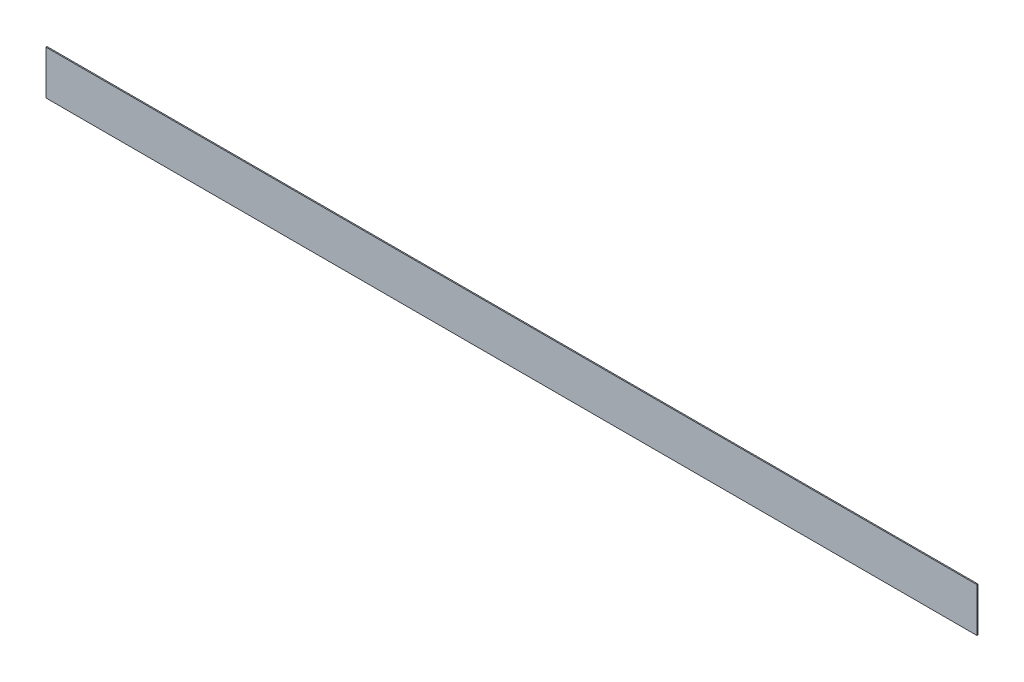
ISO-10303-21;
HEADER;
FILE_DESCRIPTION(('STEP AP214'),'2;1');
FILE_NAME('part.step','',(''),(''),'','','');
FILE_SCHEMA(('AUTOMOTIVE_DESIGN { 1 0 10303 214 1 1 1 1 }'));
ENDSEC;
DATA;
#1=APPLICATION_CONTEXT('core data for automotive mechanical design processes');
#2=APPLICATION_PROTOCOL_DEFINITION('international standard','automotive_design',2000,#1);
#3=PRODUCT_CONTEXT('',#1,'mechanical');
#4=PRODUCT('Part','Part','',(#3));
#5=PRODUCT_RELATED_PRODUCT_CATEGORY('part','',(#4));
#6=PRODUCT_DEFINITION_FORMATION('','',#4);
#7=PRODUCT_DEFINITION_CONTEXT('part definition',#1,'design');
#8=PRODUCT_DEFINITION('design','',#6,#7);
#9=PRODUCT_DEFINITION_SHAPE('','',#8);
#10=(LENGTH_UNIT() NAMED_UNIT(*) SI_UNIT(.MILLI.,.METRE.));
#11=(NAMED_UNIT(*) PLANE_ANGLE_UNIT() SI_UNIT($,.RADIAN.));
#12=(NAMED_UNIT(*) SI_UNIT($,.STERADIAN.) SOLID_ANGLE_UNIT());
#13=UNCERTAINTY_MEASURE_WITH_UNIT(LENGTH_MEASURE(1.E-05),#10,'distance_accuracy_value','');
#14=(GEOMETRIC_REPRESENTATION_CONTEXT(3) GLOBAL_UNCERTAINTY_ASSIGNED_CONTEXT((#13)) GLOBAL_UNIT_ASSIGNED_CONTEXT((#10,
#11,#12)) REPRESENTATION_CONTEXT('',''));
#15=CARTESIAN_POINT('',(0.,0.,0.));
#16=DIRECTION('',(0.,0.,1.));
#17=DIRECTION('',(1.,0.,0.));
#18=AXIS2_PLACEMENT_3D('',#15,#16,#17);
#19=CARTESIAN_POINT('',(66.,1610.,40.));
#20=DIRECTION('',(1.,0.,0.));
#21=DIRECTION('',(0.,0.,-1.));
#22=AXIS2_PLACEMENT_3D('',#19,#20,#21);
#23=PLANE('',#22);
#24=DIRECTION('',(0.,-1.,0.));
#25=VECTOR('',#24,1.);
#26=CARTESIAN_POINT('',(66.,1610.,38.5));
#27=LINE('',#26,#25);
#28=CARTESIAN_POINT('',(66.,1670.,38.5));
#29=VERTEX_POINT('',#28);
#30=CARTESIAN_POINT('',(66.,1610.,38.5));
#31=VERTEX_POINT('',#30);
#32=EDGE_CURVE('E102',#29,#31,#27,.T.);
#33=ORIENTED_EDGE('',*,*,#32,.T.);
#34=DIRECTION('',(0.,0.,-1.));
#35=VECTOR('',#34,1.);
#36=CARTESIAN_POINT('',(66.,1610.,40.));
#37=LINE('',#36,#35);
#38=CARTESIAN_POINT('',(66.,1610.,40.));
#39=VERTEX_POINT('',#38);
#40=EDGE_CURVE('E11',#39,#31,#37,.T.);
#41=ORIENTED_EDGE('',*,*,#40,.F.);
#42=DIRECTION('',(0.,-1.,0.));
#43=VECTOR('',#42,1.);
#44=CARTESIAN_POINT('',(66.,1610.,40.));
#45=LINE('',#44,#43);
#46=CARTESIAN_POINT('',(66.,1670.,40.));
#47=VERTEX_POINT('',#46);
#48=EDGE_CURVE('E90',#47,#39,#45,.T.);
#49=ORIENTED_EDGE('',*,*,#48,.F.);
#50=DIRECTION('',(0.,0.,-1.));
#51=VECTOR('',#50,1.);
#52=CARTESIAN_POINT('',(66.,1670.,40.));
#53=LINE('',#52,#51);
#54=EDGE_CURVE('E98',#47,#29,#53,.T.);
#55=ORIENTED_EDGE('',*,*,#54,.T.);
#56=EDGE_LOOP('',(#33,#41,#49,#55));
#57=FACE_BOUND('',#56,.T.);
#58=ADVANCED_FACE('F39',(#57),#23,.F.);
#59=CARTESIAN_POINT('',(66.,1610.,40.));
#60=DIRECTION('',(0.,1.,0.));
#61=DIRECTION('',(0.,0.,1.));
#62=AXIS2_PLACEMENT_3D('',#59,#60,#61);
#63=PLANE('',#62);
#64=DIRECTION('',(1.,0.,0.));
#65=VECTOR('',#64,1.);
#66=CARTESIAN_POINT('',(66.,1610.,38.5));
#67=LINE('',#66,#65);
#68=CARTESIAN_POINT('',(1334.,1610.,38.5));
#69=VERTEX_POINT('',#68);
#70=EDGE_CURVE('E94',#31,#69,#67,.T.);
#71=ORIENTED_EDGE('',*,*,#70,.T.);
#72=DIRECTION('',(0.,0.,-1.));
#73=VECTOR('',#72,1.);
#74=CARTESIAN_POINT('',(1334.,1610.,40.));
#75=LINE('',#74,#73);
#76=CARTESIAN_POINT('',(1334.,1610.,40.));
#77=VERTEX_POINT('',#76);
#78=EDGE_CURVE('E47',#77,#69,#75,.T.);
#79=ORIENTED_EDGE('',*,*,#78,.F.);
#80=DIRECTION('',(1.,0.,0.));
#81=VECTOR('',#80,1.);
#82=CARTESIAN_POINT('',(66.,1610.,40.));
#83=LINE('',#82,#81);
#84=EDGE_CURVE('E85',#39,#77,#83,.T.);
#85=ORIENTED_EDGE('',*,*,#84,.F.);
#86=ORIENTED_EDGE('',*,*,#40,.T.);
#87=EDGE_LOOP('',(#71,#79,#85,#86));
#88=FACE_BOUND('',#87,.T.);
#89=ADVANCED_FACE('F93',(#88),#63,.F.);
#90=CARTESIAN_POINT('',(1334.,1610.,40.));
#91=DIRECTION('',(-1.,0.,0.));
#92=DIRECTION('',(0.,0.,1.));
#93=AXIS2_PLACEMENT_3D('',#90,#91,#92);
#94=PLANE('',#93);
#95=DIRECTION('',(0.,1.,0.));
#96=VECTOR('',#95,1.);
#97=CARTESIAN_POINT('',(1334.,1610.,38.5));
#98=LINE('',#97,#96);
#99=CARTESIAN_POINT('',(1334.,1670.,38.5));
#100=VERTEX_POINT('',#99);
#101=EDGE_CURVE('E72',#69,#100,#98,.T.);
#102=ORIENTED_EDGE('',*,*,#101,.T.);
#103=DIRECTION('',(0.,0.,-1.));
#104=VECTOR('',#103,1.);
#105=CARTESIAN_POINT('',(1334.,1670.,40.));
#106=LINE('',#105,#104);
#107=CARTESIAN_POINT('',(1334.,1670.,40.));
#108=VERTEX_POINT('',#107);
#109=EDGE_CURVE('E95',#108,#100,#106,.T.);
#110=ORIENTED_EDGE('',*,*,#109,.F.);
#111=DIRECTION('',(0.,1.,0.));
#112=VECTOR('',#111,1.);
#113=CARTESIAN_POINT('',(1334.,1610.,40.));
#114=LINE('',#113,#112);
#115=EDGE_CURVE('E88',#77,#108,#114,.T.);
#116=ORIENTED_EDGE('',*,*,#115,.F.);
#117=ORIENTED_EDGE('',*,*,#78,.T.);
#118=EDGE_LOOP('',(#102,#110,#116,#117));
#119=FACE_BOUND('',#118,.T.);
#120=ADVANCED_FACE('F96',(#119),#94,.F.);
#121=CARTESIAN_POINT('',(66.,1670.,40.));
#122=DIRECTION('',(0.,-1.,0.));
#123=DIRECTION('',(0.,0.,-1.));
#124=AXIS2_PLACEMENT_3D('',#121,#122,#123);
#125=PLANE('',#124);
#126=DIRECTION('',(-1.,0.,0.));
#127=VECTOR('',#126,1.);
#128=CARTESIAN_POINT('',(66.,1670.,38.5));
#129=LINE('',#128,#127);
#130=EDGE_CURVE('E78',#100,#29,#129,.T.);
#131=ORIENTED_EDGE('',*,*,#130,.T.);
#132=ORIENTED_EDGE('',*,*,#54,.F.);
#133=DIRECTION('',(-1.,0.,0.));
#134=VECTOR('',#133,1.);
#135=CARTESIAN_POINT('',(66.,1670.,40.));
#136=LINE('',#135,#134);
#137=EDGE_CURVE('E55',#108,#47,#136,.T.);
#138=ORIENTED_EDGE('',*,*,#137,.F.);
#139=ORIENTED_EDGE('',*,*,#109,.T.);
#140=EDGE_LOOP('',(#131,#132,#138,#139));
#141=FACE_BOUND('',#140,.T.);
#142=ADVANCED_FACE('F109',(#141),#125,.F.);
#143=CARTESIAN_POINT('',(0.,0.,40.));
#144=DIRECTION('',(0.,0.,-1.));
#145=DIRECTION('',(-1.,0.,0.));
#146=AXIS2_PLACEMENT_3D('',#143,#144,#145);
#147=PLANE('',#146);
#148=ORIENTED_EDGE('',*,*,#48,.T.);
#149=ORIENTED_EDGE('',*,*,#84,.T.);
#150=ORIENTED_EDGE('',*,*,#115,.T.);
#151=ORIENTED_EDGE('',*,*,#137,.T.);
#152=EDGE_LOOP('',(#148,#149,#150,#151));
#153=FACE_BOUND('',#152,.T.);
#154=ADVANCED_FACE('F86',(#153),#147,.F.);
#155=CARTESIAN_POINT('',(0.,0.,38.5));
#156=DIRECTION('',(0.,0.,-1.));
#157=DIRECTION('',(-1.,0.,0.));
#158=AXIS2_PLACEMENT_3D('',#155,#156,#157);
#159=PLANE('',#158);
#160=ORIENTED_EDGE('',*,*,#32,.F.);
#161=ORIENTED_EDGE('',*,*,#130,.F.);
#162=ORIENTED_EDGE('',*,*,#101,.F.);
#163=ORIENTED_EDGE('',*,*,#70,.F.);
#164=EDGE_LOOP('',(#160,#161,#162,#163));
#165=FACE_BOUND('',#164,.T.);
#166=ADVANCED_FACE('F112',(#165),#159,.T.);
#167=CLOSED_SHELL('',(#58,#89,#120,#142,#154,#166));
#168=MANIFOLD_SOLID_BREP('B2',#167);
#169=ADVANCED_BREP_SHAPE_REPRESENTATION('',(#18,#168),#14);
#170=SHAPE_DEFINITION_REPRESENTATION(#9,#169);
ENDSEC;
END-ISO-10303-21;
